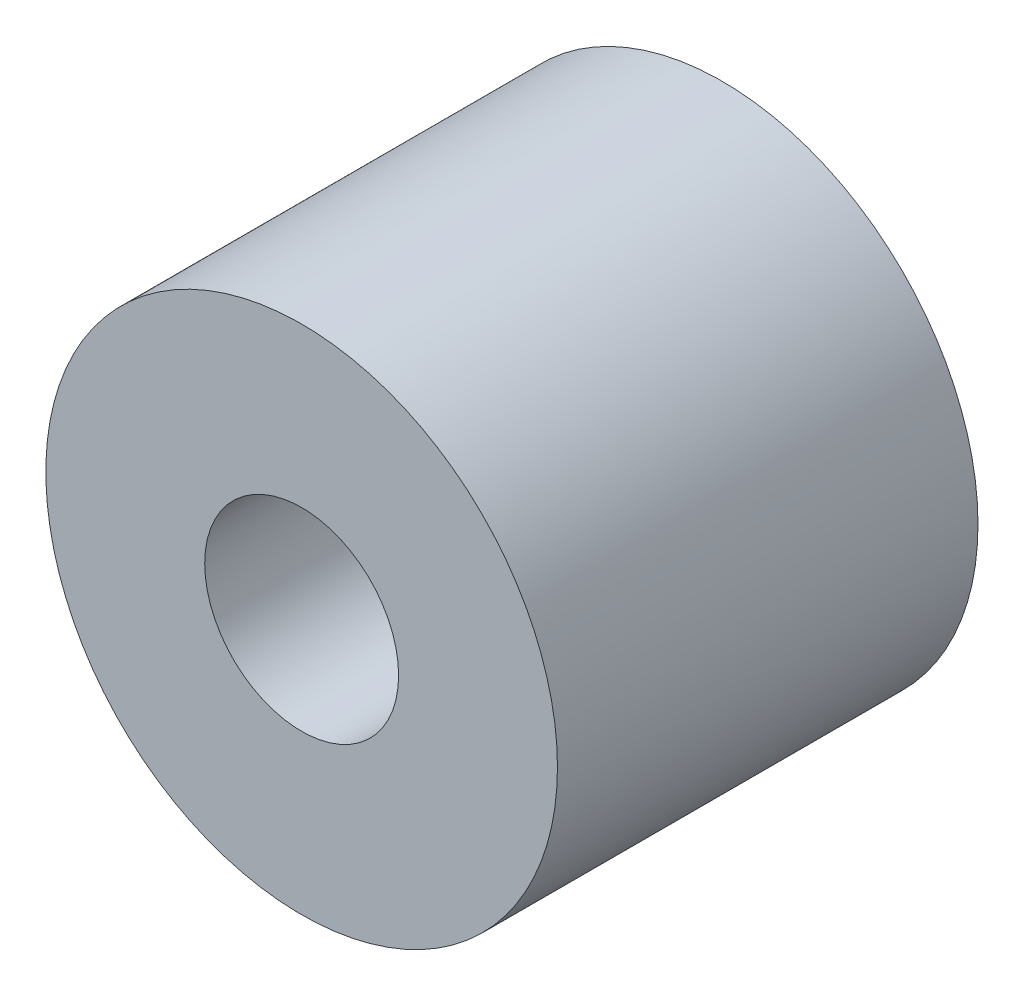
ISO-10303-21;
HEADER;
FILE_DESCRIPTION(('STEP AP214'),'2;1');
FILE_NAME('part.step','',(''),(''),'','','');
FILE_SCHEMA(('AUTOMOTIVE_DESIGN { 1 0 10303 214 1 1 1 1 }'));
ENDSEC;
DATA;
#1=APPLICATION_CONTEXT('core data for automotive mechanical design processes');
#2=APPLICATION_PROTOCOL_DEFINITION('international standard','automotive_design',2000,#1);
#3=PRODUCT_CONTEXT('',#1,'mechanical');
#4=PRODUCT('Part','Part','',(#3));
#5=PRODUCT_RELATED_PRODUCT_CATEGORY('part','',(#4));
#6=PRODUCT_DEFINITION_FORMATION('','',#4);
#7=PRODUCT_DEFINITION_CONTEXT('part definition',#1,'design');
#8=PRODUCT_DEFINITION('design','',#6,#7);
#9=PRODUCT_DEFINITION_SHAPE('','',#8);
#10=(LENGTH_UNIT() NAMED_UNIT(*) SI_UNIT(.MILLI.,.METRE.));
#11=(NAMED_UNIT(*) PLANE_ANGLE_UNIT() SI_UNIT($,.RADIAN.));
#12=(NAMED_UNIT(*) SI_UNIT($,.STERADIAN.) SOLID_ANGLE_UNIT());
#13=UNCERTAINTY_MEASURE_WITH_UNIT(LENGTH_MEASURE(1.E-05),#10,'distance_accuracy_value','');
#14=(GEOMETRIC_REPRESENTATION_CONTEXT(3) GLOBAL_UNCERTAINTY_ASSIGNED_CONTEXT((#13)) GLOBAL_UNIT_ASSIGNED_CONTEXT((#10,
#11,#12)) REPRESENTATION_CONTEXT('',''));
#15=CARTESIAN_POINT('',(0.,0.,0.));
#16=DIRECTION('',(0.,0.,1.));
#17=DIRECTION('',(1.,0.,0.));
#18=AXIS2_PLACEMENT_3D('',#15,#16,#17);
#19=CARTESIAN_POINT('',(0.,0.,18.));
#20=DIRECTION('',(0.,0.,1.));
#21=DIRECTION('',(1.,0.,0.));
#22=AXIS2_PLACEMENT_3D('',#19,#20,#21);
#23=PLANE('',#22);
#24=CARTESIAN_POINT('',(0.,0.,18.));
#25=DIRECTION('',(0.,0.,1.));
#26=DIRECTION('',(1.,0.,0.));
#27=AXIS2_PLACEMENT_3D('',#24,#25,#26);
#28=CIRCLE('',#27,10.95);
#29=CARTESIAN_POINT('',(10.95,0.,18.));
#30=VERTEX_POINT('',#29);
#31=EDGE_CURVE('E10',#30,#30,#28,.T.);
#32=ORIENTED_EDGE('',*,*,#31,.T.);
#33=EDGE_LOOP('',(#32));
#34=FACE_BOUND('',#33,.T.);
#35=CARTESIAN_POINT('',(0.,0.,18.));
#36=DIRECTION('',(0.,0.,1.));
#37=DIRECTION('',(1.,0.,0.));
#38=AXIS2_PLACEMENT_3D('',#35,#36,#37);
#39=CIRCLE('',#38,4.15);
#40=CARTESIAN_POINT('',(4.15,0.,18.));
#41=VERTEX_POINT('',#40);
#42=EDGE_CURVE('E42',#41,#41,#39,.T.);
#43=ORIENTED_EDGE('',*,*,#42,.F.);
#44=EDGE_LOOP('',(#43));
#45=FACE_BOUND('',#44,.T.);
#46=ADVANCED_FACE('F31',(#34,#45),#23,.T.);
#47=CARTESIAN_POINT('',(0.,0.,0.));
#48=DIRECTION('',(0.,0.,1.));
#49=DIRECTION('',(1.,0.,0.));
#50=AXIS2_PLACEMENT_3D('',#47,#48,#49);
#51=PLANE('',#50);
#52=CARTESIAN_POINT('',(0.,0.,0.));
#53=DIRECTION('',(0.,0.,1.));
#54=DIRECTION('',(1.,0.,0.));
#55=AXIS2_PLACEMENT_3D('',#52,#53,#54);
#56=CIRCLE('',#55,10.95);
#57=CARTESIAN_POINT('',(10.95,0.,0.));
#58=VERTEX_POINT('',#57);
#59=EDGE_CURVE('E35',#58,#58,#56,.T.);
#60=ORIENTED_EDGE('',*,*,#59,.F.);
#61=EDGE_LOOP('',(#60));
#62=FACE_BOUND('',#61,.T.);
#63=CARTESIAN_POINT('',(0.,0.,0.));
#64=DIRECTION('',(0.,0.,1.));
#65=DIRECTION('',(1.,0.,0.));
#66=AXIS2_PLACEMENT_3D('',#63,#64,#65);
#67=CIRCLE('',#66,4.15);
#68=CARTESIAN_POINT('',(4.15,0.,0.));
#69=VERTEX_POINT('',#68);
#70=EDGE_CURVE('E44',#69,#69,#67,.T.);
#71=ORIENTED_EDGE('',*,*,#70,.T.);
#72=EDGE_LOOP('',(#71));
#73=FACE_BOUND('',#72,.T.);
#74=ADVANCED_FACE('F54',(#62,#73),#51,.F.);
#75=CARTESIAN_POINT('',(0.,0.,18.));
#76=DIRECTION('',(0.,0.,-1.));
#77=DIRECTION('',(-1.,0.,0.));
#78=AXIS2_PLACEMENT_3D('',#75,#76,#77);
#79=CYLINDRICAL_SURFACE('',#78,10.95);
#80=ORIENTED_EDGE('',*,*,#31,.F.);
#81=EDGE_LOOP('',(#80));
#82=FACE_BOUND('',#81,.T.);
#83=ORIENTED_EDGE('',*,*,#59,.T.);
#84=EDGE_LOOP('',(#83));
#85=FACE_BOUND('',#84,.T.);
#86=ADVANCED_FACE('F33',(#82,#85),#79,.T.);
#87=CARTESIAN_POINT('',(0.,0.,18.));
#88=DIRECTION('',(0.,0.,-1.));
#89=DIRECTION('',(-1.,0.,0.));
#90=AXIS2_PLACEMENT_3D('',#87,#88,#89);
#91=CYLINDRICAL_SURFACE('',#90,4.15);
#92=ORIENTED_EDGE('',*,*,#42,.T.);
#93=EDGE_LOOP('',(#92));
#94=FACE_BOUND('',#93,.T.);
#95=ORIENTED_EDGE('',*,*,#70,.F.);
#96=EDGE_LOOP('',(#95));
#97=FACE_BOUND('',#96,.T.);
#98=ADVANCED_FACE('F50',(#94,#97),#91,.F.);
#99=CLOSED_SHELL('',(#46,#74,#86,#98));
#100=MANIFOLD_SOLID_BREP('B2',#99);
#101=ADVANCED_BREP_SHAPE_REPRESENTATION('',(#18,#100),#14);
#102=SHAPE_DEFINITION_REPRESENTATION(#9,#101);
ENDSEC;
END-ISO-10303-21;
